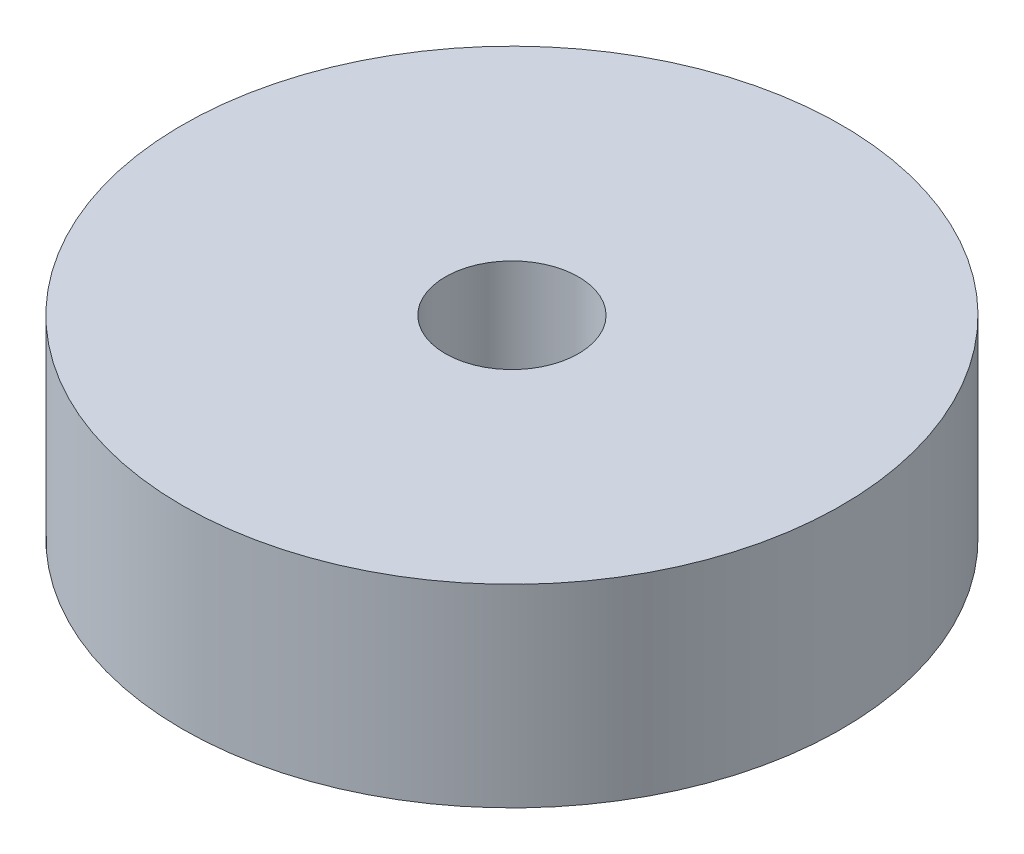
ISO-10303-21;
HEADER;
FILE_DESCRIPTION(('STEP AP214'),'2;1');
FILE_NAME('part.step','',(''),(''),'','','');
FILE_SCHEMA(('AUTOMOTIVE_DESIGN { 1 0 10303 214 1 1 1 1 }'));
ENDSEC;
DATA;
#1=APPLICATION_CONTEXT('core data for automotive mechanical design processes');
#2=APPLICATION_PROTOCOL_DEFINITION('international standard','automotive_design',2000,#1);
#3=PRODUCT_CONTEXT('',#1,'mechanical');
#4=PRODUCT('Part','Part','',(#3));
#5=PRODUCT_RELATED_PRODUCT_CATEGORY('part','',(#4));
#6=PRODUCT_DEFINITION_FORMATION('','',#4);
#7=PRODUCT_DEFINITION_CONTEXT('part definition',#1,'design');
#8=PRODUCT_DEFINITION('design','',#6,#7);
#9=PRODUCT_DEFINITION_SHAPE('','',#8);
#10=(LENGTH_UNIT() NAMED_UNIT(*) SI_UNIT(.MILLI.,.METRE.));
#11=(NAMED_UNIT(*) PLANE_ANGLE_UNIT() SI_UNIT($,.RADIAN.));
#12=(NAMED_UNIT(*) SI_UNIT($,.STERADIAN.) SOLID_ANGLE_UNIT());
#13=UNCERTAINTY_MEASURE_WITH_UNIT(LENGTH_MEASURE(1.E-05),#10,'distance_accuracy_value','');
#14=(GEOMETRIC_REPRESENTATION_CONTEXT(3) GLOBAL_UNCERTAINTY_ASSIGNED_CONTEXT((#13)) GLOBAL_UNIT_ASSIGNED_CONTEXT((#10,
#11,#12)) REPRESENTATION_CONTEXT('',''));
#15=CARTESIAN_POINT('',(0.,0.,0.));
#16=DIRECTION('',(0.,0.,1.));
#17=DIRECTION('',(1.,0.,0.));
#18=AXIS2_PLACEMENT_3D('',#15,#16,#17);
#19=CARTESIAN_POINT('',(0.,5.8166,0.));
#20=DIRECTION('',(0.,1.,0.));
#21=DIRECTION('',(0.,0.,1.));
#22=AXIS2_PLACEMENT_3D('',#19,#20,#21);
#23=PLANE('',#22);
#24=CARTESIAN_POINT('',(0.,5.8166,0.));
#25=DIRECTION('',(0.,1.,0.));
#26=DIRECTION('',(0.,0.,1.));
#27=AXIS2_PLACEMENT_3D('',#24,#25,#26);
#28=CIRCLE('',#27,9.9);
#29=CARTESIAN_POINT('',(0.,5.8166,9.9));
#30=VERTEX_POINT('',#29);
#31=EDGE_CURVE('E10',#30,#30,#28,.T.);
#32=ORIENTED_EDGE('',*,*,#31,.T.);
#33=EDGE_LOOP('',(#32));
#34=FACE_BOUND('',#33,.T.);
#35=CARTESIAN_POINT('',(0.,5.8166,0.));
#36=DIRECTION('',(0.,1.,0.));
#37=DIRECTION('',(0.,0.,1.));
#38=AXIS2_PLACEMENT_3D('',#35,#36,#37);
#39=CIRCLE('',#38,2.);
#40=CARTESIAN_POINT('',(0.,5.8166,2.));
#41=VERTEX_POINT('',#40);
#42=EDGE_CURVE('E48',#41,#41,#39,.T.);
#43=ORIENTED_EDGE('',*,*,#42,.F.);
#44=EDGE_LOOP('',(#43));
#45=FACE_BOUND('',#44,.T.);
#46=ADVANCED_FACE('F37',(#34,#45),#23,.T.);
#47=CARTESIAN_POINT('',(0.,0.,0.));
#48=DIRECTION('',(0.,1.,0.));
#49=DIRECTION('',(0.,0.,1.));
#50=AXIS2_PLACEMENT_3D('',#47,#48,#49);
#51=PLANE('',#50);
#52=CARTESIAN_POINT('',(0.,0.,0.));
#53=DIRECTION('',(0.,1.,0.));
#54=DIRECTION('',(0.,0.,1.));
#55=AXIS2_PLACEMENT_3D('',#52,#53,#54);
#56=CIRCLE('',#55,9.9);
#57=CARTESIAN_POINT('',(0.,0.,9.9));
#58=VERTEX_POINT('',#57);
#59=EDGE_CURVE('E41',#58,#58,#56,.T.);
#60=ORIENTED_EDGE('',*,*,#59,.F.);
#61=EDGE_LOOP('',(#60));
#62=FACE_BOUND('',#61,.T.);
#63=CARTESIAN_POINT('',(0.,0.,0.));
#64=DIRECTION('',(0.,1.,0.));
#65=DIRECTION('',(0.,0.,1.));
#66=AXIS2_PLACEMENT_3D('',#63,#64,#65);
#67=CIRCLE('',#66,2.);
#68=CARTESIAN_POINT('',(0.,0.,2.));
#69=VERTEX_POINT('',#68);
#70=EDGE_CURVE('E50',#69,#69,#67,.T.);
#71=ORIENTED_EDGE('',*,*,#70,.T.);
#72=EDGE_LOOP('',(#71));
#73=FACE_BOUND('',#72,.T.);
#74=ADVANCED_FACE('F60',(#62,#73),#51,.F.);
#75=CARTESIAN_POINT('',(0.,5.8166,0.));
#76=DIRECTION('',(0.,-1.,0.));
#77=DIRECTION('',(0.,0.,-1.));
#78=AXIS2_PLACEMENT_3D('',#75,#76,#77);
#79=CYLINDRICAL_SURFACE('',#78,9.9);
#80=ORIENTED_EDGE('',*,*,#31,.F.);
#81=EDGE_LOOP('',(#80));
#82=FACE_BOUND('',#81,.T.);
#83=ORIENTED_EDGE('',*,*,#59,.T.);
#84=EDGE_LOOP('',(#83));
#85=FACE_BOUND('',#84,.T.);
#86=ADVANCED_FACE('F39',(#82,#85),#79,.T.);
#87=CARTESIAN_POINT('',(0.,5.8166,0.));
#88=DIRECTION('',(0.,-1.,0.));
#89=DIRECTION('',(0.,0.,-1.));
#90=AXIS2_PLACEMENT_3D('',#87,#88,#89);
#91=CYLINDRICAL_SURFACE('',#90,2.);
#92=ORIENTED_EDGE('',*,*,#42,.T.);
#93=EDGE_LOOP('',(#92));
#94=FACE_BOUND('',#93,.T.);
#95=ORIENTED_EDGE('',*,*,#70,.F.);
#96=EDGE_LOOP('',(#95));
#97=FACE_BOUND('',#96,.T.);
#98=ADVANCED_FACE('F56',(#94,#97),#91,.F.);
#99=CLOSED_SHELL('',(#46,#74,#86,#98));
#100=MANIFOLD_SOLID_BREP('B2',#99);
#101=ADVANCED_BREP_SHAPE_REPRESENTATION('',(#18,#100),#14);
#102=SHAPE_DEFINITION_REPRESENTATION(#9,#101);
ENDSEC;
END-ISO-10303-21;
